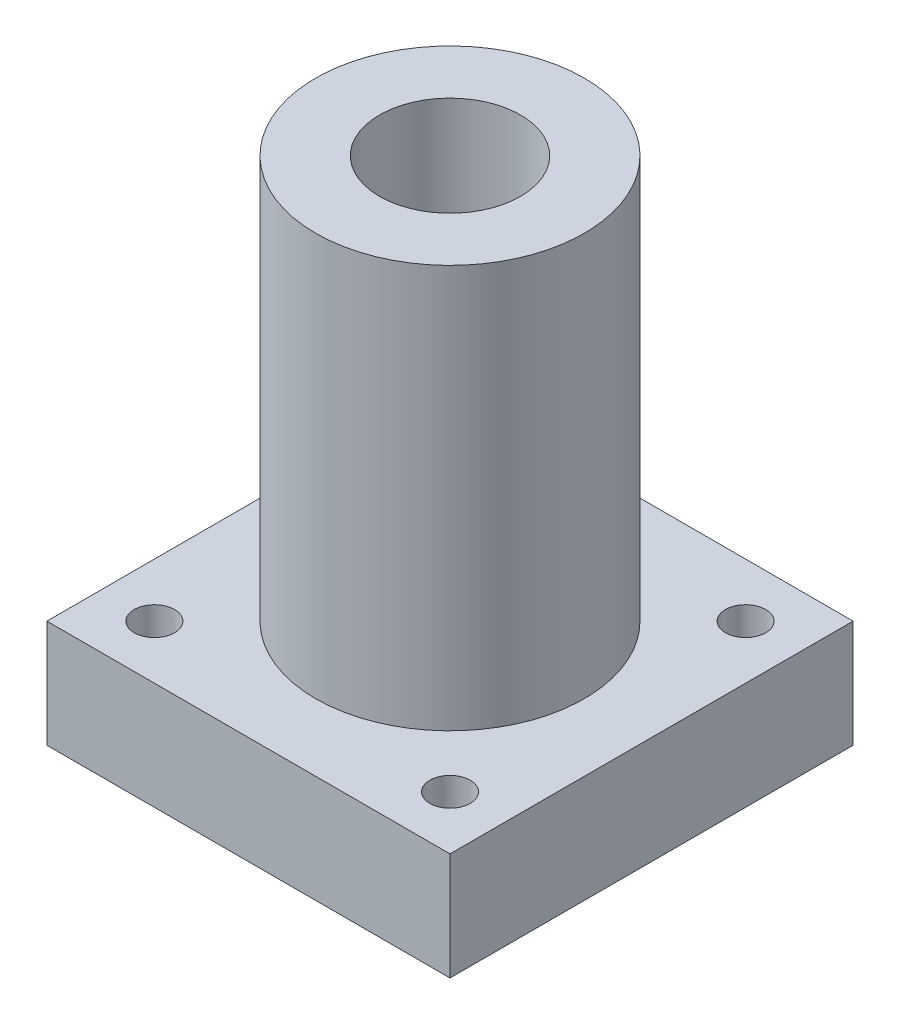
ISO-10303-21;
HEADER;
FILE_DESCRIPTION(('STEP AP214'),'2;1');
FILE_NAME('part.step','',(''),(''),'','','');
FILE_SCHEMA(('AUTOMOTIVE_DESIGN { 1 0 10303 214 1 1 1 1 }'));
ENDSEC;
DATA;
#1=APPLICATION_CONTEXT('core data for automotive mechanical design processes');
#2=APPLICATION_PROTOCOL_DEFINITION('international standard','automotive_design',2000,#1);
#3=PRODUCT_CONTEXT('',#1,'mechanical');
#4=PRODUCT('Part','Part','',(#3));
#5=PRODUCT_RELATED_PRODUCT_CATEGORY('part','',(#4));
#6=PRODUCT_DEFINITION_FORMATION('','',#4);
#7=PRODUCT_DEFINITION_CONTEXT('part definition',#1,'design');
#8=PRODUCT_DEFINITION('design','',#6,#7);
#9=PRODUCT_DEFINITION_SHAPE('','',#8);
#10=(LENGTH_UNIT() NAMED_UNIT(*) SI_UNIT(.MILLI.,.METRE.));
#11=(NAMED_UNIT(*) PLANE_ANGLE_UNIT() SI_UNIT($,.RADIAN.));
#12=(NAMED_UNIT(*) SI_UNIT($,.STERADIAN.) SOLID_ANGLE_UNIT());
#13=UNCERTAINTY_MEASURE_WITH_UNIT(LENGTH_MEASURE(1.E-05),#10,'distance_accuracy_value','');
#14=(GEOMETRIC_REPRESENTATION_CONTEXT(3) GLOBAL_UNCERTAINTY_ASSIGNED_CONTEXT((#13)) GLOBAL_UNIT_ASSIGNED_CONTEXT((#10,
#11,#12)) REPRESENTATION_CONTEXT('',''));
#15=CARTESIAN_POINT('',(0.,0.,0.));
#16=DIRECTION('',(0.,0.,1.));
#17=DIRECTION('',(1.,0.,0.));
#18=AXIS2_PLACEMENT_3D('',#15,#16,#17);
#19=CARTESIAN_POINT('',(15.,80.,-15.));
#20=DIRECTION('',(0.,-1.,0.));
#21=DIRECTION('',(0.,0.,-1.));
#22=AXIS2_PLACEMENT_3D('',#19,#20,#21);
#23=CYLINDRICAL_SURFACE('',#22,10.);
#24=CARTESIAN_POINT('',(15.,40.,-15.));
#25=DIRECTION('',(0.,-1.,0.));
#26=DIRECTION('',(0.,0.,-1.));
#27=AXIS2_PLACEMENT_3D('',#24,#25,#26);
#28=CIRCLE('',#27,10.);
#29=CARTESIAN_POINT('',(15.,40.,-25.));
#30=VERTEX_POINT('',#29);
#31=EDGE_CURVE('E11',#30,#30,#28,.F.);
#32=ORIENTED_EDGE('',*,*,#31,.T.);
#33=EDGE_LOOP('',(#32));
#34=FACE_BOUND('',#33,.T.);
#35=CARTESIAN_POINT('',(15.,70.,-15.));
#36=DIRECTION('',(0.,1.,0.));
#37=DIRECTION('',(0.,0.,1.));
#38=AXIS2_PLACEMENT_3D('',#35,#36,#37);
#39=CIRCLE('',#38,10.);
#40=CARTESIAN_POINT('',(15.,70.,-5.));
#41=VERTEX_POINT('',#40);
#42=EDGE_CURVE('E108',#41,#41,#39,.T.);
#43=ORIENTED_EDGE('',*,*,#42,.F.);
#44=EDGE_LOOP('',(#43));
#45=FACE_BOUND('',#44,.T.);
#46=ADVANCED_FACE('F33',(#34,#45),#23,.T.);
#47=CARTESIAN_POINT('',(0.,40.,0.));
#48=DIRECTION('',(1.,0.,0.));
#49=DIRECTION('',(0.,0.,-1.));
#50=AXIS2_PLACEMENT_3D('',#47,#48,#49);
#51=PLANE('',#50);
#52=DIRECTION('',(0.,-1.,0.));
#53=VECTOR('',#52,1.);
#54=CARTESIAN_POINT('',(0.,40.,-30.));
#55=LINE('',#54,#53);
#56=CARTESIAN_POINT('',(0.,40.,-30.));
#57=VERTEX_POINT('',#56);
#58=CARTESIAN_POINT('',(0.,32.,-30.));
#59=VERTEX_POINT('',#58);
#60=EDGE_CURVE('E95',#57,#59,#55,.T.);
#61=ORIENTED_EDGE('',*,*,#60,.T.);
#62=DIRECTION('',(0.,0.,-1.));
#63=VECTOR('',#62,1.);
#64=CARTESIAN_POINT('',(0.,32.,-30.));
#65=LINE('',#64,#63);
#66=CARTESIAN_POINT('',(0.,32.,0.));
#67=VERTEX_POINT('',#66);
#68=EDGE_CURVE('E50',#67,#59,#65,.T.);
#69=ORIENTED_EDGE('',*,*,#68,.F.);
#70=DIRECTION('',(0.,-1.,0.));
#71=VECTOR('',#70,1.);
#72=CARTESIAN_POINT('',(0.,40.,0.));
#73=LINE('',#72,#71);
#74=CARTESIAN_POINT('',(0.,40.,0.));
#75=VERTEX_POINT('',#74);
#76=EDGE_CURVE('E42',#75,#67,#73,.T.);
#77=ORIENTED_EDGE('',*,*,#76,.F.);
#78=DIRECTION('',(0.,0.,1.));
#79=VECTOR('',#78,1.);
#80=CARTESIAN_POINT('',(0.,40.,0.));
#81=LINE('',#80,#79);
#82=EDGE_CURVE('E139',#57,#75,#81,.T.);
#83=ORIENTED_EDGE('',*,*,#82,.F.);
#84=EDGE_LOOP('',(#61,#69,#77,#83));
#85=FACE_BOUND('',#84,.T.);
#86=ADVANCED_FACE('F35',(#85),#51,.F.);
#87=CARTESIAN_POINT('',(0.,40.,0.));
#88=DIRECTION('',(0.,0.,-1.));
#89=DIRECTION('',(-1.,0.,0.));
#90=AXIS2_PLACEMENT_3D('',#87,#88,#89);
#91=PLANE('',#90);
#92=ORIENTED_EDGE('',*,*,#76,.T.);
#93=DIRECTION('',(-1.,0.,0.));
#94=VECTOR('',#93,1.);
#95=CARTESIAN_POINT('',(0.,32.,0.));
#96=LINE('',#95,#94);
#97=CARTESIAN_POINT('',(30.,32.,0.));
#98=VERTEX_POINT('',#97);
#99=EDGE_CURVE('E92',#98,#67,#96,.T.);
#100=ORIENTED_EDGE('',*,*,#99,.F.);
#101=DIRECTION('',(0.,-1.,0.));
#102=VECTOR('',#101,1.);
#103=CARTESIAN_POINT('',(30.,40.,0.));
#104=LINE('',#103,#102);
#105=CARTESIAN_POINT('',(30.,40.,0.));
#106=VERTEX_POINT('',#105);
#107=EDGE_CURVE('E91',#106,#98,#104,.T.);
#108=ORIENTED_EDGE('',*,*,#107,.F.);
#109=DIRECTION('',(1.,0.,0.));
#110=VECTOR('',#109,1.);
#111=CARTESIAN_POINT('',(0.,40.,0.));
#112=LINE('',#111,#110);
#113=EDGE_CURVE('E141',#75,#106,#112,.T.);
#114=ORIENTED_EDGE('',*,*,#113,.F.);
#115=EDGE_LOOP('',(#92,#100,#108,#114));
#116=FACE_BOUND('',#115,.T.);
#117=ADVANCED_FACE('F148',(#116),#91,.F.);
#118=CARTESIAN_POINT('',(30.,40.,0.));
#119=DIRECTION('',(-1.,0.,0.));
#120=DIRECTION('',(0.,0.,1.));
#121=AXIS2_PLACEMENT_3D('',#118,#119,#120);
#122=PLANE('',#121);
#123=ORIENTED_EDGE('',*,*,#107,.T.);
#124=DIRECTION('',(0.,0.,1.));
#125=VECTOR('',#124,1.);
#126=CARTESIAN_POINT('',(30.,32.,-30.));
#127=LINE('',#126,#125);
#128=CARTESIAN_POINT('',(30.,32.,-30.));
#129=VERTEX_POINT('',#128);
#130=EDGE_CURVE('E78',#129,#98,#127,.T.);
#131=ORIENTED_EDGE('',*,*,#130,.F.);
#132=DIRECTION('',(0.,-1.,0.));
#133=VECTOR('',#132,1.);
#134=CARTESIAN_POINT('',(30.,40.,-30.));
#135=LINE('',#134,#133);
#136=CARTESIAN_POINT('',(30.,40.,-30.));
#137=VERTEX_POINT('',#136);
#138=EDGE_CURVE('E89',#137,#129,#135,.T.);
#139=ORIENTED_EDGE('',*,*,#138,.F.);
#140=DIRECTION('',(0.,0.,-1.));
#141=VECTOR('',#140,1.);
#142=CARTESIAN_POINT('',(30.,40.,0.));
#143=LINE('',#142,#141);
#144=EDGE_CURVE('E143',#106,#137,#143,.T.);
#145=ORIENTED_EDGE('',*,*,#144,.F.);
#146=EDGE_LOOP('',(#123,#131,#139,#145));
#147=FACE_BOUND('',#146,.T.);
#148=ADVANCED_FACE('F87',(#147),#122,.F.);
#149=CARTESIAN_POINT('',(0.,40.,-30.));
#150=DIRECTION('',(0.,0.,1.));
#151=DIRECTION('',(1.,0.,0.));
#152=AXIS2_PLACEMENT_3D('',#149,#150,#151);
#153=PLANE('',#152);
#154=ORIENTED_EDGE('',*,*,#138,.T.);
#155=DIRECTION('',(1.,0.,0.));
#156=VECTOR('',#155,1.);
#157=CARTESIAN_POINT('',(0.,32.,-30.));
#158=LINE('',#157,#156);
#159=EDGE_CURVE('E74',#59,#129,#158,.T.);
#160=ORIENTED_EDGE('',*,*,#159,.F.);
#161=ORIENTED_EDGE('',*,*,#60,.F.);
#162=DIRECTION('',(-1.,0.,0.));
#163=VECTOR('',#162,1.);
#164=CARTESIAN_POINT('',(0.,40.,-30.));
#165=LINE('',#164,#163);
#166=EDGE_CURVE('E58',#137,#57,#165,.T.);
#167=ORIENTED_EDGE('',*,*,#166,.F.);
#168=EDGE_LOOP('',(#154,#160,#161,#167));
#169=FACE_BOUND('',#168,.T.);
#170=ADVANCED_FACE('F94',(#169),#153,.F.);
#171=CARTESIAN_POINT('',(0.,40.,0.));
#172=DIRECTION('',(0.,-1.,0.));
#173=DIRECTION('',(0.,0.,-1.));
#174=AXIS2_PLACEMENT_3D('',#171,#172,#173);
#175=PLANE('',#174);
#176=ORIENTED_EDGE('',*,*,#31,.F.);
#177=EDGE_LOOP('',(#176));
#178=FACE_BOUND('',#177,.T.);
#179=CARTESIAN_POINT('',(26.,40.,-26.));
#180=DIRECTION('',(0.,1.,0.));
#181=DIRECTION('',(0.,0.,1.));
#182=AXIS2_PLACEMENT_3D('',#179,#180,#181);
#183=CIRCLE('',#182,1.5);
#184=CARTESIAN_POINT('',(26.,40.,-24.5));
#185=VERTEX_POINT('',#184);
#186=EDGE_CURVE('E128',#185,#185,#183,.T.);
#187=ORIENTED_EDGE('',*,*,#186,.F.);
#188=EDGE_LOOP('',(#187));
#189=FACE_BOUND('',#188,.T.);
#190=CARTESIAN_POINT('',(26.,40.,-4.));
#191=DIRECTION('',(0.,1.,0.));
#192=DIRECTION('',(0.,0.,1.));
#193=AXIS2_PLACEMENT_3D('',#190,#191,#192);
#194=CIRCLE('',#193,1.5);
#195=CARTESIAN_POINT('',(26.,40.,-2.5));
#196=VERTEX_POINT('',#195);
#197=EDGE_CURVE('E132',#196,#196,#194,.T.);
#198=ORIENTED_EDGE('',*,*,#197,.F.);
#199=EDGE_LOOP('',(#198));
#200=FACE_BOUND('',#199,.T.);
#201=CARTESIAN_POINT('',(4.,40.,-4.));
#202=DIRECTION('',(0.,1.,0.));
#203=DIRECTION('',(0.,0.,1.));
#204=AXIS2_PLACEMENT_3D('',#201,#202,#203);
#205=CIRCLE('',#204,1.5);
#206=CARTESIAN_POINT('',(4.,40.,-2.5));
#207=VERTEX_POINT('',#206);
#208=EDGE_CURVE('E127',#207,#207,#205,.T.);
#209=ORIENTED_EDGE('',*,*,#208,.F.);
#210=EDGE_LOOP('',(#209));
#211=FACE_BOUND('',#210,.T.);
#212=CARTESIAN_POINT('',(4.,40.,-26.));
#213=DIRECTION('',(0.,1.,0.));
#214=DIRECTION('',(0.,0.,1.));
#215=AXIS2_PLACEMENT_3D('',#212,#213,#214);
#216=CIRCLE('',#215,1.5);
#217=CARTESIAN_POINT('',(4.,40.,-24.5));
#218=VERTEX_POINT('',#217);
#219=EDGE_CURVE('E131',#218,#218,#216,.T.);
#220=ORIENTED_EDGE('',*,*,#219,.F.);
#221=EDGE_LOOP('',(#220));
#222=FACE_BOUND('',#221,.T.);
#223=ORIENTED_EDGE('',*,*,#82,.T.);
#224=ORIENTED_EDGE('',*,*,#113,.T.);
#225=ORIENTED_EDGE('',*,*,#144,.T.);
#226=ORIENTED_EDGE('',*,*,#166,.T.);
#227=EDGE_LOOP('',(#223,#224,#225,#226));
#228=FACE_BOUND('',#227,.T.);
#229=ADVANCED_FACE('F144',(#178,#189,#200,#211,#222,#228),#175,.F.);
#230=CARTESIAN_POINT('',(4.,0.,-26.));
#231=DIRECTION('',(0.,1.,0.));
#232=DIRECTION('',(0.,0.,1.));
#233=AXIS2_PLACEMENT_3D('',#230,#231,#232);
#234=CYLINDRICAL_SURFACE('',#233,1.5);
#235=CARTESIAN_POINT('',(4.,32.,-26.));
#236=DIRECTION('',(0.,1.,0.));
#237=DIRECTION('',(0.,0.,1.));
#238=AXIS2_PLACEMENT_3D('',#235,#236,#237);
#239=CIRCLE('',#238,1.5);
#240=CARTESIAN_POINT('',(4.,32.,-24.5));
#241=VERTEX_POINT('',#240);
#242=EDGE_CURVE('E124',#241,#241,#239,.F.);
#243=ORIENTED_EDGE('',*,*,#242,.T.);
#244=EDGE_LOOP('',(#243));
#245=FACE_BOUND('',#244,.T.);
#246=ORIENTED_EDGE('',*,*,#219,.T.);
#247=EDGE_LOOP('',(#246));
#248=FACE_BOUND('',#247,.T.);
#249=ADVANCED_FACE('F175',(#245,#248),#234,.F.);
#250=CARTESIAN_POINT('',(4.,0.,-4.));
#251=DIRECTION('',(0.,1.,0.));
#252=DIRECTION('',(0.,0.,1.));
#253=AXIS2_PLACEMENT_3D('',#250,#251,#252);
#254=CYLINDRICAL_SURFACE('',#253,1.5);
#255=CARTESIAN_POINT('',(4.,32.,-4.));
#256=DIRECTION('',(0.,1.,0.));
#257=DIRECTION('',(0.,0.,1.));
#258=AXIS2_PLACEMENT_3D('',#255,#256,#257);
#259=CIRCLE('',#258,1.5);
#260=CARTESIAN_POINT('',(4.,32.,-2.5));
#261=VERTEX_POINT('',#260);
#262=EDGE_CURVE('E121',#261,#261,#259,.F.);
#263=ORIENTED_EDGE('',*,*,#262,.T.);
#264=EDGE_LOOP('',(#263));
#265=FACE_BOUND('',#264,.T.);
#266=ORIENTED_EDGE('',*,*,#208,.T.);
#267=EDGE_LOOP('',(#266));
#268=FACE_BOUND('',#267,.T.);
#269=ADVANCED_FACE('F171',(#265,#268),#254,.F.);
#270=CARTESIAN_POINT('',(26.,0.,-4.));
#271=DIRECTION('',(0.,1.,0.));
#272=DIRECTION('',(0.,0.,1.));
#273=AXIS2_PLACEMENT_3D('',#270,#271,#272);
#274=CYLINDRICAL_SURFACE('',#273,1.5);
#275=CARTESIAN_POINT('',(26.,32.,-4.));
#276=DIRECTION('',(0.,1.,0.));
#277=DIRECTION('',(0.,0.,1.));
#278=AXIS2_PLACEMENT_3D('',#275,#276,#277);
#279=CIRCLE('',#278,1.5);
#280=CARTESIAN_POINT('',(26.,32.,-2.5));
#281=VERTEX_POINT('',#280);
#282=EDGE_CURVE('E105',#281,#281,#279,.F.);
#283=ORIENTED_EDGE('',*,*,#282,.T.);
#284=EDGE_LOOP('',(#283));
#285=FACE_BOUND('',#284,.T.);
#286=ORIENTED_EDGE('',*,*,#197,.T.);
#287=EDGE_LOOP('',(#286));
#288=FACE_BOUND('',#287,.T.);
#289=ADVANCED_FACE('F167',(#285,#288),#274,.F.);
#290=CARTESIAN_POINT('',(26.,0.,-26.));
#291=DIRECTION('',(0.,1.,0.));
#292=DIRECTION('',(0.,0.,1.));
#293=AXIS2_PLACEMENT_3D('',#290,#291,#292);
#294=CYLINDRICAL_SURFACE('',#293,1.5);
#295=CARTESIAN_POINT('',(26.,32.,-26.));
#296=DIRECTION('',(0.,1.,0.));
#297=DIRECTION('',(0.,0.,1.));
#298=AXIS2_PLACEMENT_3D('',#295,#296,#297);
#299=CIRCLE('',#298,1.5);
#300=CARTESIAN_POINT('',(26.,32.,-24.5));
#301=VERTEX_POINT('',#300);
#302=EDGE_CURVE('E103',#301,#301,#299,.F.);
#303=ORIENTED_EDGE('',*,*,#302,.T.);
#304=EDGE_LOOP('',(#303));
#305=FACE_BOUND('',#304,.T.);
#306=ORIENTED_EDGE('',*,*,#186,.T.);
#307=EDGE_LOOP('',(#306));
#308=FACE_BOUND('',#307,.T.);
#309=ADVANCED_FACE('F164',(#305,#308),#294,.F.);
#310=CARTESIAN_POINT('',(0.,32.,0.));
#311=DIRECTION('',(0.,1.,0.));
#312=DIRECTION('',(0.,0.,1.));
#313=AXIS2_PLACEMENT_3D('',#310,#311,#312);
#314=PLANE('',#313);
#315=CARTESIAN_POINT('',(15.,32.,-15.));
#316=DIRECTION('',(0.,1.,0.));
#317=DIRECTION('',(0.,0.,1.));
#318=AXIS2_PLACEMENT_3D('',#315,#316,#317);
#319=CIRCLE('',#318,5.25);
#320=CARTESIAN_POINT('',(15.,32.,-9.75));
#321=VERTEX_POINT('',#320);
#322=EDGE_CURVE('E37',#321,#321,#319,.T.);
#323=ORIENTED_EDGE('',*,*,#322,.T.);
#324=EDGE_LOOP('',(#323));
#325=FACE_BOUND('',#324,.T.);
#326=ORIENTED_EDGE('',*,*,#262,.F.);
#327=EDGE_LOOP('',(#326));
#328=FACE_BOUND('',#327,.T.);
#329=ORIENTED_EDGE('',*,*,#302,.F.);
#330=EDGE_LOOP('',(#329));
#331=FACE_BOUND('',#330,.T.);
#332=ORIENTED_EDGE('',*,*,#68,.T.);
#333=ORIENTED_EDGE('',*,*,#159,.T.);
#334=ORIENTED_EDGE('',*,*,#130,.T.);
#335=ORIENTED_EDGE('',*,*,#99,.T.);
#336=EDGE_LOOP('',(#332,#333,#334,#335));
#337=FACE_BOUND('',#336,.T.);
#338=ORIENTED_EDGE('',*,*,#282,.F.);
#339=EDGE_LOOP('',(#338));
#340=FACE_BOUND('',#339,.T.);
#341=ORIENTED_EDGE('',*,*,#242,.F.);
#342=EDGE_LOOP('',(#341));
#343=FACE_BOUND('',#342,.T.);
#344=ADVANCED_FACE('F76',(#325,#328,#331,#337,#340,#343),#314,.F.);
#345=CARTESIAN_POINT('',(15.,70.,-15.));
#346=DIRECTION('',(0.,1.,0.));
#347=DIRECTION('',(0.,0.,1.));
#348=AXIS2_PLACEMENT_3D('',#345,#346,#347);
#349=PLANE('',#348);
#350=CARTESIAN_POINT('',(15.,70.,-15.));
#351=DIRECTION('',(0.,1.,0.));
#352=DIRECTION('',(0.,0.,1.));
#353=AXIS2_PLACEMENT_3D('',#350,#351,#352);
#354=CIRCLE('',#353,5.25);
#355=CARTESIAN_POINT('',(15.,70.,-9.75));
#356=VERTEX_POINT('',#355);
#357=EDGE_CURVE('E106',#356,#356,#354,.T.);
#358=ORIENTED_EDGE('',*,*,#357,.F.);
#359=EDGE_LOOP('',(#358));
#360=FACE_BOUND('',#359,.T.);
#361=ORIENTED_EDGE('',*,*,#42,.T.);
#362=EDGE_LOOP('',(#361));
#363=FACE_BOUND('',#362,.T.);
#364=ADVANCED_FACE('F220',(#360,#363),#349,.T.);
#365=CARTESIAN_POINT('',(15.,80.,-15.));
#366=DIRECTION('',(0.,-1.,0.));
#367=DIRECTION('',(0.,0.,-1.));
#368=AXIS2_PLACEMENT_3D('',#365,#366,#367);
#369=CYLINDRICAL_SURFACE('',#368,5.25);
#370=ORIENTED_EDGE('',*,*,#357,.T.);
#371=EDGE_LOOP('',(#370));
#372=FACE_BOUND('',#371,.T.);
#373=ORIENTED_EDGE('',*,*,#322,.F.);
#374=EDGE_LOOP('',(#373));
#375=FACE_BOUND('',#374,.T.);
#376=ADVANCED_FACE('F162',(#372,#375),#369,.F.);
#377=CLOSED_SHELL('',(#46,#86,#117,#148,#170,#229,#249,#269,#289,#309,#344,#364,#376));
#378=MANIFOLD_SOLID_BREP('B2',#377);
#379=ADVANCED_BREP_SHAPE_REPRESENTATION('',(#18,#378),#14);
#380=SHAPE_DEFINITION_REPRESENTATION(#9,#379);
ENDSEC;
END-ISO-10303-21;
